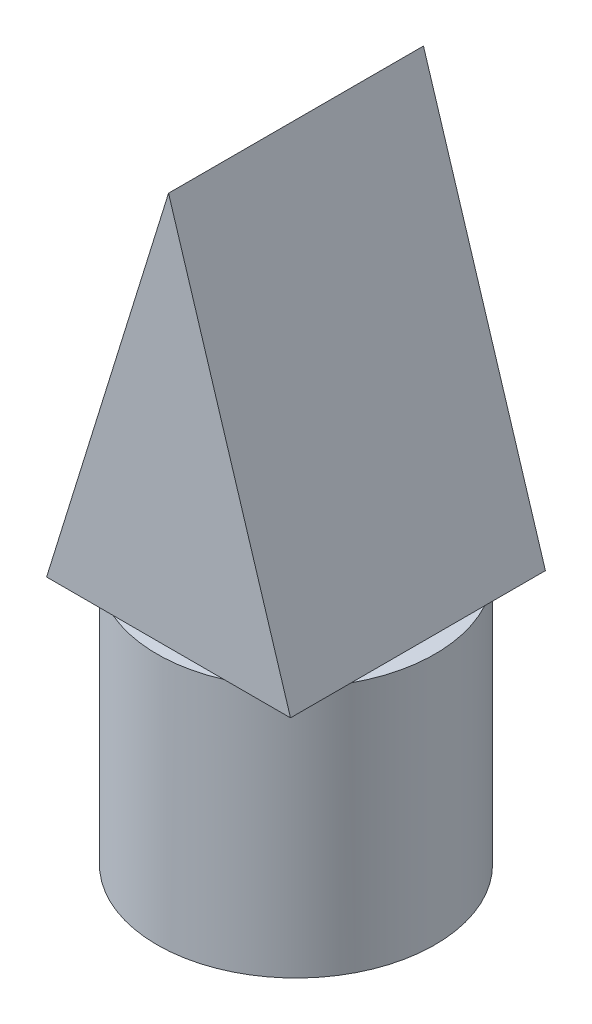
ISO-10303-21;
HEADER;
FILE_DESCRIPTION(('STEP AP214'),'2;1');
FILE_NAME('part.step','',(''),(''),'','','');
FILE_SCHEMA(('AUTOMOTIVE_DESIGN { 1 0 10303 214 1 1 1 1 }'));
ENDSEC;
DATA;
#1=APPLICATION_CONTEXT('core data for automotive mechanical design processes');
#2=APPLICATION_PROTOCOL_DEFINITION('international standard','automotive_design',2000,#1);
#3=PRODUCT_CONTEXT('',#1,'mechanical');
#4=PRODUCT('Part','Part','',(#3));
#5=PRODUCT_RELATED_PRODUCT_CATEGORY('part','',(#4));
#6=PRODUCT_DEFINITION_FORMATION('','',#4);
#7=PRODUCT_DEFINITION_CONTEXT('part definition',#1,'design');
#8=PRODUCT_DEFINITION('design','',#6,#7);
#9=PRODUCT_DEFINITION_SHAPE('','',#8);
#10=(LENGTH_UNIT() NAMED_UNIT(*) SI_UNIT(.MILLI.,.METRE.));
#11=(NAMED_UNIT(*) PLANE_ANGLE_UNIT() SI_UNIT($,.RADIAN.));
#12=(NAMED_UNIT(*) SI_UNIT($,.STERADIAN.) SOLID_ANGLE_UNIT());
#13=UNCERTAINTY_MEASURE_WITH_UNIT(LENGTH_MEASURE(1.E-05),#10,'distance_accuracy_value','');
#14=(GEOMETRIC_REPRESENTATION_CONTEXT(3) GLOBAL_UNCERTAINTY_ASSIGNED_CONTEXT((#13)) GLOBAL_UNIT_ASSIGNED_CONTEXT((#10,
#11,#12)) REPRESENTATION_CONTEXT('',''));
#15=CARTESIAN_POINT('',(0.,0.,0.));
#16=DIRECTION('',(0.,0.,1.));
#17=DIRECTION('',(1.,0.,0.));
#18=AXIS2_PLACEMENT_3D('',#15,#16,#17);
#19=CARTESIAN_POINT('',(0.,9.6,0.));
#20=DIRECTION('',(0.,1.,0.));
#21=DIRECTION('',(0.,0.,1.));
#22=AXIS2_PLACEMENT_3D('',#19,#20,#21);
#23=PLANE('',#22);
#24=CARTESIAN_POINT('',(0.,9.6,0.));
#25=DIRECTION('',(0.,1.,0.));
#26=DIRECTION('',(0.,0.,1.));
#27=AXIS2_PLACEMENT_3D('',#24,#25,#26);
#28=CIRCLE('',#27,5.3);
#29=CARTESIAN_POINT('',(2.1143320458244,9.6,-4.86));
#30=VERTEX_POINT('',#29);
#31=CARTESIAN_POINT('',(-2.1143320458244,9.6,-4.86));
#32=VERTEX_POINT('',#31);
#33=EDGE_CURVE('E310',#30,#32,#28,.T.);
#34=ORIENTED_EDGE('',*,*,#33,.T.);
#35=DIRECTION('',(1.,0.,0.));
#36=VECTOR('',#35,1.);
#37=CARTESIAN_POINT('',(-4.65,9.6,-4.86));
#38=LINE('',#37,#36);
#39=EDGE_CURVE('E11',#32,#30,#38,.T.);
#40=ORIENTED_EDGE('',*,*,#39,.T.);
#41=EDGE_LOOP('',(#34,#40));
#42=FACE_BOUND('',#41,.T.);
#43=ADVANCED_FACE('F39',(#42),#23,.T.);
#44=DIRECTION('',(0.,0.,-1.));
#45=VECTOR('',#44,1.);
#46=CARTESIAN_POINT('',(4.65,9.6,4.86));
#47=LINE('',#46,#45);
#48=CARTESIAN_POINT('',(4.65,9.6,2.54312799520591));
#49=VERTEX_POINT('',#48);
#50=CARTESIAN_POINT('',(4.65,9.6,-2.54312799520591));
#51=VERTEX_POINT('',#50);
#52=EDGE_CURVE('E48',#49,#51,#47,.T.);
#53=ORIENTED_EDGE('',*,*,#52,.F.);
#54=EDGE_CURVE('E132',#49,#51,#28,.T.);
#55=ORIENTED_EDGE('',*,*,#54,.T.);
#56=EDGE_LOOP('',(#53,#55));
#57=FACE_BOUND('',#56,.T.);
#58=ADVANCED_FACE('F173',(#57),#23,.T.);
#59=CARTESIAN_POINT('',(-4.65,9.6,-2.54312799520591));
#60=VERTEX_POINT('',#59);
#61=CARTESIAN_POINT('',(-4.65,9.6,2.54312799520591));
#62=VERTEX_POINT('',#61);
#63=EDGE_CURVE('E147',#60,#62,#28,.T.);
#64=ORIENTED_EDGE('',*,*,#63,.T.);
#65=DIRECTION('',(0.,0.,-1.));
#66=VECTOR('',#65,1.);
#67=CARTESIAN_POINT('',(-4.65,9.6,4.86));
#68=LINE('',#67,#66);
#69=EDGE_CURVE('E61',#62,#60,#68,.T.);
#70=ORIENTED_EDGE('',*,*,#69,.T.);
#71=EDGE_LOOP('',(#64,#70));
#72=FACE_BOUND('',#71,.T.);
#73=ADVANCED_FACE('F180',(#72),#23,.T.);
#74=DIRECTION('',(1.,0.,0.));
#75=VECTOR('',#74,1.);
#76=CARTESIAN_POINT('',(-4.65,9.6,4.86));
#77=LINE('',#76,#75);
#78=CARTESIAN_POINT('',(-2.1143320458244,9.6,4.86));
#79=VERTEX_POINT('',#78);
#80=CARTESIAN_POINT('',(2.1143320458244,9.6,4.86));
#81=VERTEX_POINT('',#80);
#82=EDGE_CURVE('E111',#79,#81,#77,.T.);
#83=ORIENTED_EDGE('',*,*,#82,.F.);
#84=EDGE_CURVE('E134',#79,#81,#28,.T.);
#85=ORIENTED_EDGE('',*,*,#84,.T.);
#86=EDGE_LOOP('',(#83,#85));
#87=FACE_BOUND('',#86,.T.);
#88=ADVANCED_FACE('F171',(#87),#23,.T.);
#89=CARTESIAN_POINT('',(0.,0.,0.));
#90=DIRECTION('',(0.,1.,0.));
#91=DIRECTION('',(0.,0.,1.));
#92=AXIS2_PLACEMENT_3D('',#89,#90,#91);
#93=PLANE('',#92);
#94=CARTESIAN_POINT('',(0.,0.,0.));
#95=DIRECTION('',(0.,1.,0.));
#96=DIRECTION('',(0.,0.,1.));
#97=AXIS2_PLACEMENT_3D('',#94,#95,#96);
#98=CIRCLE('',#97,5.3);
#99=CARTESIAN_POINT('',(0.,0.,5.3));
#100=VERTEX_POINT('',#99);
#101=EDGE_CURVE('E43',#100,#100,#98,.T.);
#102=ORIENTED_EDGE('',*,*,#101,.F.);
#103=EDGE_LOOP('',(#102));
#104=FACE_BOUND('',#103,.T.);
#105=CARTESIAN_POINT('',(0.,0.,0.));
#106=DIRECTION('',(0.,1.,0.));
#107=DIRECTION('',(0.,0.,1.));
#108=AXIS2_PLACEMENT_3D('',#105,#106,#107);
#109=CIRCLE('',#108,3.5);
#110=CARTESIAN_POINT('',(0.,0.,3.5));
#111=VERTEX_POINT('',#110);
#112=EDGE_CURVE('E128',#111,#111,#109,.T.);
#113=ORIENTED_EDGE('',*,*,#112,.T.);
#114=EDGE_LOOP('',(#113));
#115=FACE_BOUND('',#114,.T.);
#116=ADVANCED_FACE('F151',(#104,#115),#93,.F.);
#117=CARTESIAN_POINT('',(0.,9.6,0.));
#118=DIRECTION('',(0.,-1.,0.));
#119=DIRECTION('',(0.,0.,-1.));
#120=AXIS2_PLACEMENT_3D('',#117,#118,#119);
#121=CYLINDRICAL_SURFACE('',#120,5.3);
#122=EDGE_CURVE('E127',#81,#49,#28,.T.);
#123=ORIENTED_EDGE('',*,*,#122,.F.);
#124=ORIENTED_EDGE('',*,*,#84,.F.);
#125=EDGE_CURVE('E108',#62,#79,#28,.T.);
#126=ORIENTED_EDGE('',*,*,#125,.F.);
#127=ORIENTED_EDGE('',*,*,#63,.F.);
#128=EDGE_CURVE('E308',#32,#60,#28,.T.);
#129=ORIENTED_EDGE('',*,*,#128,.F.);
#130=ORIENTED_EDGE('',*,*,#33,.F.);
#131=EDGE_CURVE('E141',#51,#30,#28,.T.);
#132=ORIENTED_EDGE('',*,*,#131,.F.);
#133=ORIENTED_EDGE('',*,*,#54,.F.);
#134=EDGE_LOOP('',(#123,#124,#126,#127,#129,#130,#132,#133));
#135=FACE_BOUND('',#134,.T.);
#136=ORIENTED_EDGE('',*,*,#101,.T.);
#137=EDGE_LOOP('',(#136));
#138=FACE_BOUND('',#137,.T.);
#139=ADVANCED_FACE('F41',(#135,#138),#121,.T.);
#140=CARTESIAN_POINT('',(0.,9.6,0.));
#141=DIRECTION('',(0.,-1.,0.));
#142=DIRECTION('',(0.,0.,-1.));
#143=AXIS2_PLACEMENT_3D('',#140,#141,#142);
#144=CYLINDRICAL_SURFACE('',#143,3.5);
#145=CARTESIAN_POINT('',(0.,9.6,0.));
#146=DIRECTION('',(0.,1.,0.));
#147=DIRECTION('',(0.,0.,1.));
#148=AXIS2_PLACEMENT_3D('',#145,#146,#147);
#149=CIRCLE('',#148,3.5);
#150=CARTESIAN_POINT('',(0.,9.6,3.5));
#151=VERTEX_POINT('',#150);
#152=EDGE_CURVE('E121',#151,#151,#149,.T.);
#153=ORIENTED_EDGE('',*,*,#152,.T.);
#154=EDGE_LOOP('',(#153));
#155=FACE_BOUND('',#154,.T.);
#156=ORIENTED_EDGE('',*,*,#112,.F.);
#157=EDGE_LOOP('',(#156));
#158=FACE_BOUND('',#157,.T.);
#159=ADVANCED_FACE('F154',(#155,#158),#144,.F.);
#160=CARTESIAN_POINT('',(0.,0.,-4.86));
#161=DIRECTION('',(0.,0.,-1.));
#162=DIRECTION('',(-1.,0.,0.));
#163=AXIS2_PLACEMENT_3D('',#160,#161,#162);
#164=PLANE('',#163);
#165=DIRECTION('',(-0.296098771114081,-0.955157326174453,0.));
#166=VECTOR('',#165,1.);
#167=CARTESIAN_POINT('',(-4.65,9.6,-4.86));
#168=LINE('',#167,#166);
#169=CARTESIAN_POINT('',(0.,24.6,-4.86));
#170=VERTEX_POINT('',#169);
#171=CARTESIAN_POINT('',(-4.65,9.6,-4.86));
#172=VERTEX_POINT('',#171);
#173=EDGE_CURVE('E199',#170,#172,#168,.T.);
#174=ORIENTED_EDGE('',*,*,#173,.F.);
#175=DIRECTION('',(-0.296098771114081,0.955157326174453,0.));
#176=VECTOR('',#175,1.);
#177=CARTESIAN_POINT('',(0.,24.6,-4.86));
#178=LINE('',#177,#176);
#179=CARTESIAN_POINT('',(4.65,9.6,-4.86));
#180=VERTEX_POINT('',#179);
#181=EDGE_CURVE('E119',#180,#170,#178,.T.);
#182=ORIENTED_EDGE('',*,*,#181,.F.);
#183=EDGE_CURVE('E51',#30,#180,#38,.T.);
#184=ORIENTED_EDGE('',*,*,#183,.F.);
#185=ORIENTED_EDGE('',*,*,#39,.F.);
#186=EDGE_CURVE('E49',#172,#32,#38,.T.);
#187=ORIENTED_EDGE('',*,*,#186,.F.);
#188=EDGE_LOOP('',(#174,#182,#184,#185,#187));
#189=FACE_BOUND('',#188,.T.);
#190=ADVANCED_FACE('F160',(#189),#164,.T.);
#191=CARTESIAN_POINT('',(0.,0.,4.86));
#192=DIRECTION('',(0.,0.,-1.));
#193=DIRECTION('',(-1.,0.,0.));
#194=AXIS2_PLACEMENT_3D('',#191,#192,#193);
#195=PLANE('',#194);
#196=DIRECTION('',(-0.296098771114081,-0.955157326174453,0.));
#197=VECTOR('',#196,1.);
#198=CARTESIAN_POINT('',(-4.65,9.6,4.86));
#199=LINE('',#198,#197);
#200=CARTESIAN_POINT('',(0.,24.6,4.86));
#201=VERTEX_POINT('',#200);
#202=CARTESIAN_POINT('',(-4.65,9.6,4.86));
#203=VERTEX_POINT('',#202);
#204=EDGE_CURVE('E113',#201,#203,#199,.T.);
#205=ORIENTED_EDGE('',*,*,#204,.T.);
#206=EDGE_CURVE('E102',#203,#79,#77,.T.);
#207=ORIENTED_EDGE('',*,*,#206,.T.);
#208=ORIENTED_EDGE('',*,*,#82,.T.);
#209=CARTESIAN_POINT('',(4.65,9.6,4.86));
#210=VERTEX_POINT('',#209);
#211=EDGE_CURVE('E112',#81,#210,#77,.T.);
#212=ORIENTED_EDGE('',*,*,#211,.T.);
#213=DIRECTION('',(-0.296098771114081,0.955157326174453,0.));
#214=VECTOR('',#213,1.);
#215=CARTESIAN_POINT('',(0.,24.6,4.86));
#216=LINE('',#215,#214);
#217=EDGE_CURVE('E109',#210,#201,#216,.T.);
#218=ORIENTED_EDGE('',*,*,#217,.T.);
#219=EDGE_LOOP('',(#205,#207,#208,#212,#218));
#220=FACE_BOUND('',#219,.T.);
#221=ADVANCED_FACE('F118',(#220),#195,.F.);
#222=CARTESIAN_POINT('',(0.,24.6,4.86));
#223=DIRECTION('',(-0.955157326174453,-0.296098771114081,0.));
#224=DIRECTION('',(0.296098771114081,-0.955157326174453,0.));
#225=AXIS2_PLACEMENT_3D('',#222,#223,#224);
#226=PLANE('',#225);
#227=ORIENTED_EDGE('',*,*,#181,.T.);
#228=DIRECTION('',(0.,0.,-1.));
#229=VECTOR('',#228,1.);
#230=CARTESIAN_POINT('',(0.,24.6,4.86));
#231=LINE('',#230,#229);
#232=EDGE_CURVE('E194',#201,#170,#231,.T.);
#233=ORIENTED_EDGE('',*,*,#232,.F.);
#234=ORIENTED_EDGE('',*,*,#217,.F.);
#235=EDGE_CURVE('E126',#210,#49,#47,.T.);
#236=ORIENTED_EDGE('',*,*,#235,.T.);
#237=ORIENTED_EDGE('',*,*,#52,.T.);
#238=EDGE_CURVE('E192',#51,#180,#47,.T.);
#239=ORIENTED_EDGE('',*,*,#238,.T.);
#240=EDGE_LOOP('',(#227,#233,#234,#236,#237,#239));
#241=FACE_BOUND('',#240,.T.);
#242=ADVANCED_FACE('F208',(#241),#226,.F.);
#243=CARTESIAN_POINT('',(-4.65,9.6,4.86));
#244=DIRECTION('',(0.955157326174453,-0.296098771114081,0.));
#245=DIRECTION('',(0.296098771114081,0.955157326174453,0.));
#246=AXIS2_PLACEMENT_3D('',#243,#244,#245);
#247=PLANE('',#246);
#248=ORIENTED_EDGE('',*,*,#173,.T.);
#249=EDGE_CURVE('E59',#60,#172,#68,.T.);
#250=ORIENTED_EDGE('',*,*,#249,.F.);
#251=ORIENTED_EDGE('',*,*,#69,.F.);
#252=EDGE_CURVE('E101',#203,#62,#68,.T.);
#253=ORIENTED_EDGE('',*,*,#252,.F.);
#254=ORIENTED_EDGE('',*,*,#204,.F.);
#255=ORIENTED_EDGE('',*,*,#232,.T.);
#256=EDGE_LOOP('',(#248,#250,#251,#253,#254,#255));
#257=FACE_BOUND('',#256,.T.);
#258=ADVANCED_FACE('F122',(#257),#247,.F.);
#259=CARTESIAN_POINT('',(-4.65,9.6,4.86));
#260=DIRECTION('',(0.,1.,0.));
#261=DIRECTION('',(0.,0.,1.));
#262=AXIS2_PLACEMENT_3D('',#259,#260,#261);
#263=PLANE('',#262);
#264=ORIENTED_EDGE('',*,*,#252,.T.);
#265=ORIENTED_EDGE('',*,*,#125,.T.);
#266=ORIENTED_EDGE('',*,*,#206,.F.);
#267=EDGE_LOOP('',(#264,#265,#266));
#268=FACE_BOUND('',#267,.T.);
#269=ADVANCED_FACE('F104',(#268),#263,.F.);
#270=ORIENTED_EDGE('',*,*,#186,.T.);
#271=ORIENTED_EDGE('',*,*,#128,.T.);
#272=ORIENTED_EDGE('',*,*,#249,.T.);
#273=EDGE_LOOP('',(#270,#271,#272));
#274=FACE_BOUND('',#273,.T.);
#275=ADVANCED_FACE('F218',(#274),#263,.F.);
#276=ORIENTED_EDGE('',*,*,#238,.F.);
#277=ORIENTED_EDGE('',*,*,#131,.T.);
#278=ORIENTED_EDGE('',*,*,#183,.T.);
#279=EDGE_LOOP('',(#276,#277,#278));
#280=FACE_BOUND('',#279,.T.);
#281=ADVANCED_FACE('F204',(#280),#263,.F.);
#282=ORIENTED_EDGE('',*,*,#211,.F.);
#283=ORIENTED_EDGE('',*,*,#122,.T.);
#284=ORIENTED_EDGE('',*,*,#235,.F.);
#285=EDGE_LOOP('',(#282,#283,#284));
#286=FACE_BOUND('',#285,.T.);
#287=ADVANCED_FACE('F210',(#286),#263,.F.);
#288=ORIENTED_EDGE('',*,*,#152,.F.);
#289=EDGE_LOOP('',(#288));
#290=FACE_BOUND('',#289,.T.);
#291=ADVANCED_FACE('F207',(#290),#263,.F.);
#292=CLOSED_SHELL('',(#43,#58,#73,#88,#116,#139,#159,#190,#221,#242,#258,#269,#275,#281,#287,#291));
#293=MANIFOLD_SOLID_BREP('B2',#292);
#294=ADVANCED_BREP_SHAPE_REPRESENTATION('',(#18,#293),#14);
#295=SHAPE_DEFINITION_REPRESENTATION(#9,#294);
ENDSEC;
END-ISO-10303-21;
